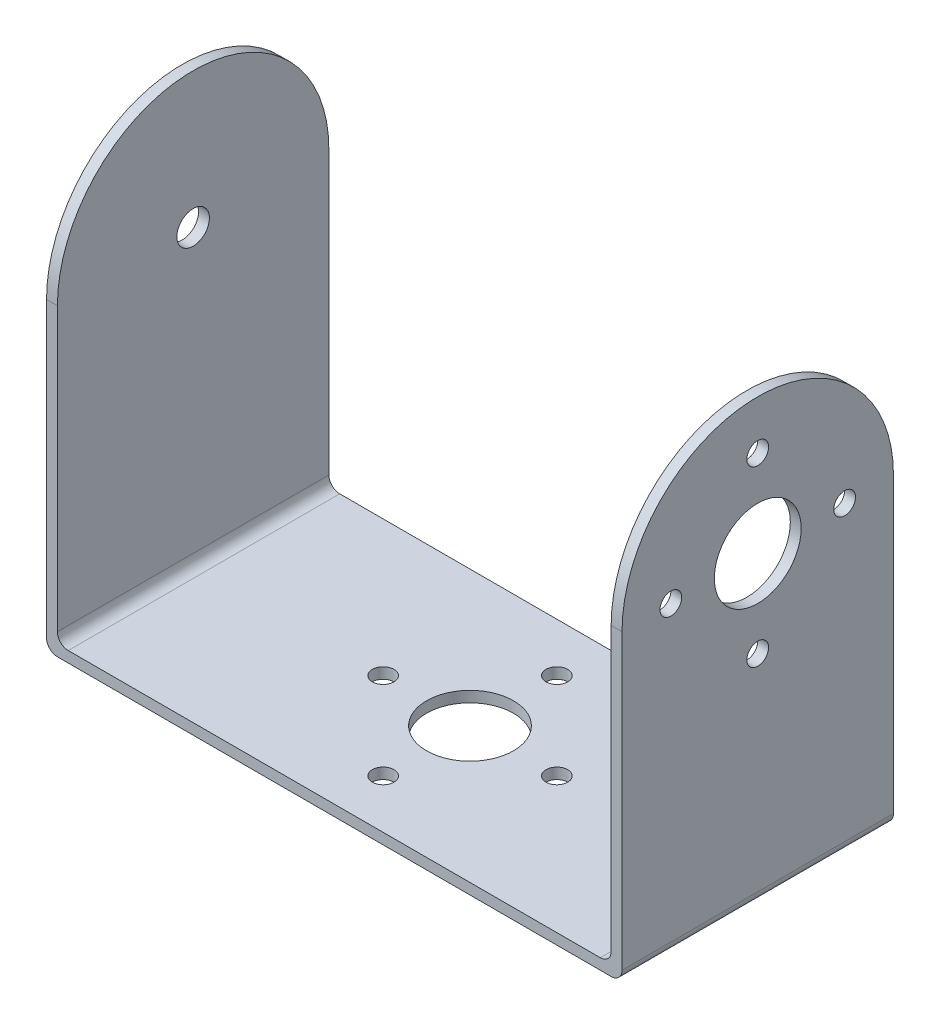
ISO-10303-21;
HEADER;
FILE_DESCRIPTION(('STEP AP214'),'2;1');
FILE_NAME('part.step','',(''),(''),'','','');
FILE_SCHEMA(('AUTOMOTIVE_DESIGN { 1 0 10303 214 1 1 1 1 }'));
ENDSEC;
DATA;
#1=APPLICATION_CONTEXT('core data for automotive mechanical design processes');
#2=APPLICATION_PROTOCOL_DEFINITION('international standard','automotive_design',2000,#1);
#3=PRODUCT_CONTEXT('',#1,'mechanical');
#4=PRODUCT('Part','Part','',(#3));
#5=PRODUCT_RELATED_PRODUCT_CATEGORY('part','',(#4));
#6=PRODUCT_DEFINITION_FORMATION('','',#4);
#7=PRODUCT_DEFINITION_CONTEXT('part definition',#1,'design');
#8=PRODUCT_DEFINITION('design','',#6,#7);
#9=PRODUCT_DEFINITION_SHAPE('','',#8);
#10=(LENGTH_UNIT() NAMED_UNIT(*) SI_UNIT(.MILLI.,.METRE.));
#11=(NAMED_UNIT(*) PLANE_ANGLE_UNIT() SI_UNIT($,.RADIAN.));
#12=(NAMED_UNIT(*) SI_UNIT($,.STERADIAN.) SOLID_ANGLE_UNIT());
#13=UNCERTAINTY_MEASURE_WITH_UNIT(LENGTH_MEASURE(1.E-05),#10,'distance_accuracy_value','');
#14=(GEOMETRIC_REPRESENTATION_CONTEXT(3) GLOBAL_UNCERTAINTY_ASSIGNED_CONTEXT((#13)) GLOBAL_UNIT_ASSIGNED_CONTEXT((#10,
#11,#12)) REPRESENTATION_CONTEXT('',''));
#15=CARTESIAN_POINT('',(0.,0.,0.));
#16=DIRECTION('',(0.,0.,1.));
#17=DIRECTION('',(1.,0.,0.));
#18=AXIS2_PLACEMENT_3D('',#15,#16,#17);
#19=CARTESIAN_POINT('',(51.5,1.50000000000001,-25.));
#20=DIRECTION('',(-1.,0.,0.));
#21=DIRECTION('',(0.,0.,1.));
#22=AXIS2_PLACEMENT_3D('',#19,#20,#21);
#23=PLANE('',#22);
#24=CARTESIAN_POINT('',(51.5,27.5,-4.50000000000011));
#25=DIRECTION('',(-1.,0.,0.));
#26=DIRECTION('',(0.,0.,1.));
#27=AXIS2_PLACEMENT_3D('',#24,#25,#26);
#28=CIRCLE('',#27,1.);
#29=CARTESIAN_POINT('',(51.5,27.5,-3.50000000000011));
#30=VERTEX_POINT('',#29);
#31=EDGE_CURVE('E313',#30,#30,#28,.T.);
#32=ORIENTED_EDGE('',*,*,#31,.F.);
#33=EDGE_LOOP('',(#32));
#34=FACE_BOUND('',#33,.T.);
#35=CARTESIAN_POINT('',(51.5,19.5,-12.5000000000002));
#36=DIRECTION('',(-1.,0.,0.));
#37=DIRECTION('',(0.,0.,1.));
#38=AXIS2_PLACEMENT_3D('',#35,#36,#37);
#39=CIRCLE('',#38,1.);
#40=CARTESIAN_POINT('',(51.5,19.5,-11.5000000000002));
#41=VERTEX_POINT('',#40);
#42=EDGE_CURVE('E307',#41,#41,#39,.T.);
#43=ORIENTED_EDGE('',*,*,#42,.F.);
#44=EDGE_LOOP('',(#43));
#45=FACE_BOUND('',#44,.T.);
#46=CARTESIAN_POINT('',(51.5,27.5000000000001,-20.5000000000001));
#47=DIRECTION('',(-1.,0.,0.));
#48=DIRECTION('',(0.,0.,1.));
#49=AXIS2_PLACEMENT_3D('',#46,#47,#48);
#50=CIRCLE('',#49,1.);
#51=CARTESIAN_POINT('',(51.5,27.5000000000001,-19.5000000000001));
#52=VERTEX_POINT('',#51);
#53=EDGE_CURVE('E301',#52,#52,#50,.T.);
#54=ORIENTED_EDGE('',*,*,#53,.F.);
#55=EDGE_LOOP('',(#54));
#56=FACE_BOUND('',#55,.T.);
#57=CARTESIAN_POINT('',(51.5,35.5,-12.5));
#58=DIRECTION('',(-1.,0.,0.));
#59=DIRECTION('',(0.,0.,1.));
#60=AXIS2_PLACEMENT_3D('',#57,#58,#59);
#61=CIRCLE('',#60,1.);
#62=CARTESIAN_POINT('',(51.5,35.5,-11.5));
#63=VERTEX_POINT('',#62);
#64=EDGE_CURVE('E295',#63,#63,#61,.T.);
#65=ORIENTED_EDGE('',*,*,#64,.F.);
#66=EDGE_LOOP('',(#65));
#67=FACE_BOUND('',#66,.T.);
#68=CARTESIAN_POINT('',(51.5,27.5,-12.5));
#69=DIRECTION('',(-1.,0.,0.));
#70=DIRECTION('',(0.,0.,1.));
#71=AXIS2_PLACEMENT_3D('',#68,#69,#70);
#72=CIRCLE('',#71,4.);
#73=CARTESIAN_POINT('',(51.5,27.5,-8.5));
#74=VERTEX_POINT('',#73);
#75=EDGE_CURVE('E287',#74,#74,#72,.T.);
#76=ORIENTED_EDGE('',*,*,#75,.F.);
#77=EDGE_LOOP('',(#76));
#78=FACE_BOUND('',#77,.T.);
#79=CARTESIAN_POINT('',(51.5,27.5,-12.5));
#80=DIRECTION('',(-1.,0.,0.));
#81=DIRECTION('',(0.,0.,1.));
#82=AXIS2_PLACEMENT_3D('',#79,#80,#81);
#83=CIRCLE('',#82,12.5);
#84=CARTESIAN_POINT('',(51.5,27.5,0.));
#85=VERTEX_POINT('',#84);
#86=CARTESIAN_POINT('',(51.5,27.5,-25.));
#87=VERTEX_POINT('',#86);
#88=EDGE_CURVE('E56',#85,#87,#83,.T.);
#89=ORIENTED_EDGE('',*,*,#88,.T.);
#90=DIRECTION('',(0.,-1.,0.));
#91=VECTOR('',#90,1.);
#92=CARTESIAN_POINT('',(51.5,1.50000000000001,-25.));
#93=LINE('',#92,#91);
#94=CARTESIAN_POINT('',(51.5,1.50000000000001,-25.));
#95=VERTEX_POINT('',#94);
#96=EDGE_CURVE('E145',#87,#95,#93,.T.);
#97=ORIENTED_EDGE('',*,*,#96,.T.);
#98=DIRECTION('',(0.,0.,1.));
#99=VECTOR('',#98,1.);
#100=CARTESIAN_POINT('',(51.5,1.50000000000001,-25.));
#101=LINE('',#100,#99);
#102=CARTESIAN_POINT('',(51.5,1.50000000000001,0.));
#103=VERTEX_POINT('',#102);
#104=EDGE_CURVE('E184',#95,#103,#101,.T.);
#105=ORIENTED_EDGE('',*,*,#104,.T.);
#106=DIRECTION('',(0.,-1.,0.));
#107=VECTOR('',#106,1.);
#108=CARTESIAN_POINT('',(51.5,1.50000000000001,0.));
#109=LINE('',#108,#107);
#110=EDGE_CURVE('E181',#85,#103,#109,.T.);
#111=ORIENTED_EDGE('',*,*,#110,.F.);
#112=EDGE_LOOP('',(#89,#97,#105,#111));
#113=FACE_BOUND('',#112,.T.);
#114=ADVANCED_FACE('F40',(#34,#45,#56,#67,#78,#113),#23,.T.);
#115=CARTESIAN_POINT('',(52.5,0.500000000000007,-25.));
#116=DIRECTION('',(1.,0.,0.));
#117=DIRECTION('',(0.,0.,-1.));
#118=AXIS2_PLACEMENT_3D('',#115,#116,#117);
#119=PLANE('',#118);
#120=CARTESIAN_POINT('',(52.5,27.5,-4.50000000000011));
#121=DIRECTION('',(1.,0.,0.));
#122=DIRECTION('',(0.,0.,-1.));
#123=AXIS2_PLACEMENT_3D('',#120,#121,#122);
#124=CIRCLE('',#123,1.);
#125=CARTESIAN_POINT('',(52.5,27.5,-5.50000000000011));
#126=VERTEX_POINT('',#125);
#127=EDGE_CURVE('E316',#126,#126,#124,.T.);
#128=ORIENTED_EDGE('',*,*,#127,.F.);
#129=EDGE_LOOP('',(#128));
#130=FACE_BOUND('',#129,.T.);
#131=CARTESIAN_POINT('',(52.5,19.5,-12.5000000000002));
#132=DIRECTION('',(1.,0.,0.));
#133=DIRECTION('',(0.,0.,-1.));
#134=AXIS2_PLACEMENT_3D('',#131,#132,#133);
#135=CIRCLE('',#134,1.);
#136=CARTESIAN_POINT('',(52.5,19.5,-13.5000000000002));
#137=VERTEX_POINT('',#136);
#138=EDGE_CURVE('E310',#137,#137,#135,.T.);
#139=ORIENTED_EDGE('',*,*,#138,.F.);
#140=EDGE_LOOP('',(#139));
#141=FACE_BOUND('',#140,.T.);
#142=CARTESIAN_POINT('',(52.5,27.5000000000001,-20.5000000000001));
#143=DIRECTION('',(1.,0.,0.));
#144=DIRECTION('',(0.,0.,-1.));
#145=AXIS2_PLACEMENT_3D('',#142,#143,#144);
#146=CIRCLE('',#145,1.);
#147=CARTESIAN_POINT('',(52.5,27.5000000000001,-21.5000000000001));
#148=VERTEX_POINT('',#147);
#149=EDGE_CURVE('E304',#148,#148,#146,.T.);
#150=ORIENTED_EDGE('',*,*,#149,.F.);
#151=EDGE_LOOP('',(#150));
#152=FACE_BOUND('',#151,.T.);
#153=CARTESIAN_POINT('',(52.5,35.5,-12.5));
#154=DIRECTION('',(1.,0.,0.));
#155=DIRECTION('',(0.,0.,-1.));
#156=AXIS2_PLACEMENT_3D('',#153,#154,#155);
#157=CIRCLE('',#156,1.);
#158=CARTESIAN_POINT('',(52.5,35.5,-13.5));
#159=VERTEX_POINT('',#158);
#160=EDGE_CURVE('E298',#159,#159,#157,.T.);
#161=ORIENTED_EDGE('',*,*,#160,.F.);
#162=EDGE_LOOP('',(#161));
#163=FACE_BOUND('',#162,.T.);
#164=CARTESIAN_POINT('',(52.5,27.5,-12.5));
#165=DIRECTION('',(1.,0.,0.));
#166=DIRECTION('',(0.,0.,-1.));
#167=AXIS2_PLACEMENT_3D('',#164,#165,#166);
#168=CIRCLE('',#167,4.);
#169=CARTESIAN_POINT('',(52.5,27.5,-16.5));
#170=VERTEX_POINT('',#169);
#171=EDGE_CURVE('E292',#170,#170,#168,.T.);
#172=ORIENTED_EDGE('',*,*,#171,.F.);
#173=EDGE_LOOP('',(#172));
#174=FACE_BOUND('',#173,.T.);
#175=DIRECTION('',(0.,1.,0.));
#176=VECTOR('',#175,1.);
#177=CARTESIAN_POINT('',(52.5,0.500000000000007,-25.));
#178=LINE('',#177,#176);
#179=CARTESIAN_POINT('',(52.5,0.500000000000007,-25.));
#180=VERTEX_POINT('',#179);
#181=CARTESIAN_POINT('',(52.5,27.5,-25.));
#182=VERTEX_POINT('',#181);
#183=EDGE_CURVE('E142',#180,#182,#178,.T.);
#184=ORIENTED_EDGE('',*,*,#183,.T.);
#185=CARTESIAN_POINT('',(52.5,27.5,-12.5));
#186=DIRECTION('',(1.,0.,0.));
#187=DIRECTION('',(0.,0.,-1.));
#188=AXIS2_PLACEMENT_3D('',#185,#186,#187);
#189=CIRCLE('',#188,12.5);
#190=CARTESIAN_POINT('',(52.5,27.5,0.));
#191=VERTEX_POINT('',#190);
#192=EDGE_CURVE('E128',#182,#191,#189,.T.);
#193=ORIENTED_EDGE('',*,*,#192,.T.);
#194=DIRECTION('',(0.,1.,0.));
#195=VECTOR('',#194,1.);
#196=CARTESIAN_POINT('',(52.5,0.500000000000007,0.));
#197=LINE('',#196,#195);
#198=CARTESIAN_POINT('',(52.5,0.500000000000007,0.));
#199=VERTEX_POINT('',#198);
#200=EDGE_CURVE('E179',#199,#191,#197,.T.);
#201=ORIENTED_EDGE('',*,*,#200,.F.);
#202=DIRECTION('',(0.,0.,1.));
#203=VECTOR('',#202,1.);
#204=CARTESIAN_POINT('',(52.5,0.500000000000007,-25.));
#205=LINE('',#204,#203);
#206=EDGE_CURVE('E147',#180,#199,#205,.T.);
#207=ORIENTED_EDGE('',*,*,#206,.F.);
#208=EDGE_LOOP('',(#184,#193,#201,#207));
#209=FACE_BOUND('',#208,.T.);
#210=ADVANCED_FACE('F146',(#130,#141,#152,#163,#174,#209),#119,.T.);
#211=CARTESIAN_POINT('',(-0.5,0.500000000000007,-25.));
#212=DIRECTION('',(-1.,0.,0.));
#213=DIRECTION('',(0.,0.,1.));
#214=AXIS2_PLACEMENT_3D('',#211,#212,#213);
#215=PLANE('',#214);
#216=CARTESIAN_POINT('',(-0.5,27.5,-12.5));
#217=DIRECTION('',(-1.,0.,0.));
#218=DIRECTION('',(0.,0.,1.));
#219=AXIS2_PLACEMENT_3D('',#216,#217,#218);
#220=CIRCLE('',#219,1.5);
#221=CARTESIAN_POINT('',(-0.5,27.5,-11.));
#222=VERTEX_POINT('',#221);
#223=EDGE_CURVE('E319',#222,#222,#220,.T.);
#224=ORIENTED_EDGE('',*,*,#223,.F.);
#225=EDGE_LOOP('',(#224));
#226=FACE_BOUND('',#225,.T.);
#227=CARTESIAN_POINT('',(-0.5,27.5,-12.5));
#228=DIRECTION('',(1.,0.,0.));
#229=DIRECTION('',(0.,0.,-1.));
#230=AXIS2_PLACEMENT_3D('',#227,#228,#229);
#231=CIRCLE('',#230,12.5);
#232=CARTESIAN_POINT('',(-0.5,27.5,-25.));
#233=VERTEX_POINT('',#232);
#234=CARTESIAN_POINT('',(-0.5,27.5,0.));
#235=VERTEX_POINT('',#234);
#236=EDGE_CURVE('E64',#233,#235,#231,.T.);
#237=ORIENTED_EDGE('',*,*,#236,.F.);
#238=DIRECTION('',(0.,-1.,0.));
#239=VECTOR('',#238,1.);
#240=CARTESIAN_POINT('',(-0.5,0.500000000000007,-25.));
#241=LINE('',#240,#239);
#242=CARTESIAN_POINT('',(-0.5,0.500000000000007,-25.));
#243=VERTEX_POINT('',#242);
#244=EDGE_CURVE('E227',#233,#243,#241,.T.);
#245=ORIENTED_EDGE('',*,*,#244,.T.);
#246=DIRECTION('',(0.,0.,1.));
#247=VECTOR('',#246,1.);
#248=CARTESIAN_POINT('',(-0.5,0.500000000000007,-25.));
#249=LINE('',#248,#247);
#250=CARTESIAN_POINT('',(-0.5,0.500000000000007,0.));
#251=VERTEX_POINT('',#250);
#252=EDGE_CURVE('E192',#243,#251,#249,.T.);
#253=ORIENTED_EDGE('',*,*,#252,.T.);
#254=DIRECTION('',(0.,-1.,0.));
#255=VECTOR('',#254,1.);
#256=CARTESIAN_POINT('',(-0.5,0.500000000000007,0.));
#257=LINE('',#256,#255);
#258=EDGE_CURVE('E168',#235,#251,#257,.T.);
#259=ORIENTED_EDGE('',*,*,#258,.F.);
#260=EDGE_LOOP('',(#237,#245,#253,#259));
#261=FACE_BOUND('',#260,.T.);
#262=ADVANCED_FACE('F244',(#226,#261),#215,.T.);
#263=CARTESIAN_POINT('',(0.5,1.50000000000001,-25.));
#264=DIRECTION('',(1.,0.,0.));
#265=DIRECTION('',(0.,0.,-1.));
#266=AXIS2_PLACEMENT_3D('',#263,#264,#265);
#267=PLANE('',#266);
#268=CARTESIAN_POINT('',(0.5,27.5,-12.5));
#269=DIRECTION('',(1.,0.,0.));
#270=DIRECTION('',(0.,0.,-1.));
#271=AXIS2_PLACEMENT_3D('',#268,#269,#270);
#272=CIRCLE('',#271,1.5);
#273=CARTESIAN_POINT('',(0.5,27.5,-14.));
#274=VERTEX_POINT('',#273);
#275=EDGE_CURVE('E44',#274,#274,#272,.T.);
#276=ORIENTED_EDGE('',*,*,#275,.F.);
#277=EDGE_LOOP('',(#276));
#278=FACE_BOUND('',#277,.T.);
#279=DIRECTION('',(0.,1.,0.));
#280=VECTOR('',#279,1.);
#281=CARTESIAN_POINT('',(0.5,1.50000000000001,-25.));
#282=LINE('',#281,#280);
#283=CARTESIAN_POINT('',(0.5,1.50000000000001,-25.));
#284=VERTEX_POINT('',#283);
#285=CARTESIAN_POINT('',(0.5,27.5,-25.));
#286=VERTEX_POINT('',#285);
#287=EDGE_CURVE('E224',#284,#286,#282,.T.);
#288=ORIENTED_EDGE('',*,*,#287,.T.);
#289=CARTESIAN_POINT('',(0.5,27.5,-12.5));
#290=DIRECTION('',(1.,0.,0.));
#291=DIRECTION('',(0.,0.,-1.));
#292=AXIS2_PLACEMENT_3D('',#289,#290,#291);
#293=CIRCLE('',#292,12.5);
#294=CARTESIAN_POINT('',(0.5,27.5,0.));
#295=VERTEX_POINT('',#294);
#296=EDGE_CURVE('E253',#286,#295,#293,.T.);
#297=ORIENTED_EDGE('',*,*,#296,.T.);
#298=DIRECTION('',(0.,1.,0.));
#299=VECTOR('',#298,1.);
#300=CARTESIAN_POINT('',(0.5,1.50000000000001,0.));
#301=LINE('',#300,#299);
#302=CARTESIAN_POINT('',(0.5,1.50000000000001,0.));
#303=VERTEX_POINT('',#302);
#304=EDGE_CURVE('E165',#303,#295,#301,.T.);
#305=ORIENTED_EDGE('',*,*,#304,.F.);
#306=DIRECTION('',(0.,0.,1.));
#307=VECTOR('',#306,1.);
#308=CARTESIAN_POINT('',(0.5,1.50000000000001,-25.));
#309=LINE('',#308,#307);
#310=EDGE_CURVE('E195',#284,#303,#309,.T.);
#311=ORIENTED_EDGE('',*,*,#310,.F.);
#312=EDGE_LOOP('',(#288,#297,#305,#311));
#313=FACE_BOUND('',#312,.T.);
#314=ADVANCED_FACE('F251',(#278,#313),#267,.T.);
#315=CARTESIAN_POINT('',(50.5,1.5,-25.));
#316=DIRECTION('',(0.,0.,1.));
#317=DIRECTION('',(1.,0.,0.));
#318=AXIS2_PLACEMENT_3D('',#315,#316,#317);
#319=CYLINDRICAL_SURFACE('',#318,1.);
#320=CARTESIAN_POINT('',(50.5,1.5,0.));
#321=DIRECTION('',(0.,0.,-1.));
#322=DIRECTION('',(1.,0.,0.));
#323=AXIS2_PLACEMENT_3D('',#320,#321,#322);
#324=CIRCLE('',#323,1.);
#325=CARTESIAN_POINT('',(50.5,0.5,0.));
#326=VERTEX_POINT('',#325);
#327=EDGE_CURVE('E156',#103,#326,#324,.T.);
#328=ORIENTED_EDGE('',*,*,#327,.F.);
#329=ORIENTED_EDGE('',*,*,#104,.F.);
#330=CARTESIAN_POINT('',(50.5,1.5,-25.));
#331=DIRECTION('',(0.,0.,-1.));
#332=DIRECTION('',(1.,0.,0.));
#333=AXIS2_PLACEMENT_3D('',#330,#331,#332);
#334=CIRCLE('',#333,1.);
#335=CARTESIAN_POINT('',(50.5,0.5,-25.));
#336=VERTEX_POINT('',#335);
#337=EDGE_CURVE('E183',#95,#336,#334,.T.);
#338=ORIENTED_EDGE('',*,*,#337,.T.);
#339=DIRECTION('',(0.,0.,1.));
#340=VECTOR('',#339,1.);
#341=CARTESIAN_POINT('',(50.5,0.5,-25.));
#342=LINE('',#341,#340);
#343=EDGE_CURVE('E150',#336,#326,#342,.T.);
#344=ORIENTED_EDGE('',*,*,#343,.T.);
#345=EDGE_LOOP('',(#328,#329,#338,#344));
#346=FACE_BOUND('',#345,.T.);
#347=ADVANCED_FACE('F42',(#346),#319,.F.);
#348=CARTESIAN_POINT('',(51.5,0.5,-25.));
#349=DIRECTION('',(0.,0.,1.));
#350=DIRECTION('',(1.,0.,0.));
#351=AXIS2_PLACEMENT_3D('',#348,#349,#350);
#352=CYLINDRICAL_SURFACE('',#351,1.);
#353=CARTESIAN_POINT('',(51.5,0.5,0.));
#354=DIRECTION('',(0.,0.,1.));
#355=DIRECTION('',(1.,0.,0.));
#356=AXIS2_PLACEMENT_3D('',#353,#354,#355);
#357=CIRCLE('',#356,1.);
#358=CARTESIAN_POINT('',(51.5,-0.5,0.));
#359=VERTEX_POINT('',#358);
#360=EDGE_CURVE('E176',#359,#199,#357,.T.);
#361=ORIENTED_EDGE('',*,*,#360,.F.);
#362=DIRECTION('',(0.,0.,1.));
#363=VECTOR('',#362,1.);
#364=CARTESIAN_POINT('',(51.5,-0.5,-25.));
#365=LINE('',#364,#363);
#366=CARTESIAN_POINT('',(51.5,-0.5,-25.));
#367=VERTEX_POINT('',#366);
#368=EDGE_CURVE('E188',#367,#359,#365,.T.);
#369=ORIENTED_EDGE('',*,*,#368,.F.);
#370=CARTESIAN_POINT('',(51.5,0.5,-25.));
#371=DIRECTION('',(0.,0.,1.));
#372=DIRECTION('',(1.,0.,0.));
#373=AXIS2_PLACEMENT_3D('',#370,#371,#372);
#374=CIRCLE('',#373,1.);
#375=EDGE_CURVE('E148',#367,#180,#374,.T.);
#376=ORIENTED_EDGE('',*,*,#375,.T.);
#377=ORIENTED_EDGE('',*,*,#206,.T.);
#378=EDGE_LOOP('',(#361,#369,#376,#377));
#379=FACE_BOUND('',#378,.T.);
#380=ADVANCED_FACE('F334',(#379),#352,.T.);
#381=CARTESIAN_POINT('',(0.500000000000007,-0.5,-25.));
#382=DIRECTION('',(0.,-1.,0.));
#383=DIRECTION('',(0.,0.,-1.));
#384=AXIS2_PLACEMENT_3D('',#381,#382,#383);
#385=PLANE('',#384);
#386=CARTESIAN_POINT('',(26.0000000000002,-0.5,-4.5));
#387=DIRECTION('',(0.,1.,0.));
#388=DIRECTION('',(0.,0.,1.));
#389=AXIS2_PLACEMENT_3D('',#386,#387,#388);
#390=CIRCLE('',#389,1.);
#391=CARTESIAN_POINT('',(26.0000000000002,-0.5,-3.5));
#392=VERTEX_POINT('',#391);
#393=EDGE_CURVE('E284',#392,#392,#390,.T.);
#394=ORIENTED_EDGE('',*,*,#393,.T.);
#395=EDGE_LOOP('',(#394));
#396=FACE_BOUND('',#395,.T.);
#397=CARTESIAN_POINT('',(18.0000000000001,-0.5,-12.5));
#398=DIRECTION('',(0.,1.,0.));
#399=DIRECTION('',(0.,0.,1.));
#400=AXIS2_PLACEMENT_3D('',#397,#398,#399);
#401=CIRCLE('',#400,1.);
#402=CARTESIAN_POINT('',(18.0000000000001,-0.5,-11.5));
#403=VERTEX_POINT('',#402);
#404=EDGE_CURVE('E278',#403,#403,#401,.T.);
#405=ORIENTED_EDGE('',*,*,#404,.T.);
#406=EDGE_LOOP('',(#405));
#407=FACE_BOUND('',#406,.T.);
#408=CARTESIAN_POINT('',(26.,-0.5,-20.5));
#409=DIRECTION('',(0.,1.,0.));
#410=DIRECTION('',(0.,0.,1.));
#411=AXIS2_PLACEMENT_3D('',#408,#409,#410);
#412=CIRCLE('',#411,1.);
#413=CARTESIAN_POINT('',(26.,-0.5,-19.5));
#414=VERTEX_POINT('',#413);
#415=EDGE_CURVE('E272',#414,#414,#412,.T.);
#416=ORIENTED_EDGE('',*,*,#415,.T.);
#417=EDGE_LOOP('',(#416));
#418=FACE_BOUND('',#417,.T.);
#419=CARTESIAN_POINT('',(34.0000000000001,-0.5,-12.5000000000001));
#420=DIRECTION('',(0.,1.,0.));
#421=DIRECTION('',(0.,0.,1.));
#422=AXIS2_PLACEMENT_3D('',#419,#420,#421);
#423=CIRCLE('',#422,1.);
#424=CARTESIAN_POINT('',(34.0000000000001,-0.5,-11.5000000000001));
#425=VERTEX_POINT('',#424);
#426=EDGE_CURVE('E266',#425,#425,#423,.T.);
#427=ORIENTED_EDGE('',*,*,#426,.T.);
#428=EDGE_LOOP('',(#427));
#429=FACE_BOUND('',#428,.T.);
#430=CARTESIAN_POINT('',(26.,-0.5,-12.5));
#431=DIRECTION('',(0.,1.,0.));
#432=DIRECTION('',(0.,0.,1.));
#433=AXIS2_PLACEMENT_3D('',#430,#431,#432);
#434=CIRCLE('',#433,4.);
#435=CARTESIAN_POINT('',(26.,-0.5,-8.5));
#436=VERTEX_POINT('',#435);
#437=EDGE_CURVE('E247',#436,#436,#434,.T.);
#438=ORIENTED_EDGE('',*,*,#437,.T.);
#439=EDGE_LOOP('',(#438));
#440=FACE_BOUND('',#439,.T.);
#441=DIRECTION('',(1.,0.,0.));
#442=VECTOR('',#441,1.);
#443=CARTESIAN_POINT('',(0.500000000000007,-0.5,0.));
#444=LINE('',#443,#442);
#445=CARTESIAN_POINT('',(0.500000000000007,-0.5,0.));
#446=VERTEX_POINT('',#445);
#447=EDGE_CURVE('E173',#446,#359,#444,.T.);
#448=ORIENTED_EDGE('',*,*,#447,.F.);
#449=DIRECTION('',(0.,0.,1.));
#450=VECTOR('',#449,1.);
#451=CARTESIAN_POINT('',(0.500000000000007,-0.5,-25.));
#452=LINE('',#451,#450);
#453=CARTESIAN_POINT('',(0.500000000000007,-0.5,-25.));
#454=VERTEX_POINT('',#453);
#455=EDGE_CURVE('E190',#454,#446,#452,.T.);
#456=ORIENTED_EDGE('',*,*,#455,.F.);
#457=DIRECTION('',(1.,0.,0.));
#458=VECTOR('',#457,1.);
#459=CARTESIAN_POINT('',(0.500000000000007,-0.5,-25.));
#460=LINE('',#459,#458);
#461=EDGE_CURVE('E152',#454,#367,#460,.T.);
#462=ORIENTED_EDGE('',*,*,#461,.T.);
#463=ORIENTED_EDGE('',*,*,#368,.T.);
#464=EDGE_LOOP('',(#448,#456,#462,#463));
#465=FACE_BOUND('',#464,.T.);
#466=ADVANCED_FACE('F235',(#396,#407,#418,#429,#440,#465),#385,.T.);
#467=CARTESIAN_POINT('',(0.5,0.5,-25.));
#468=DIRECTION('',(0.,0.,1.));
#469=DIRECTION('',(1.,0.,0.));
#470=AXIS2_PLACEMENT_3D('',#467,#468,#469);
#471=CYLINDRICAL_SURFACE('',#470,1.);
#472=CARTESIAN_POINT('',(0.5,0.5,0.));
#473=DIRECTION('',(0.,0.,1.));
#474=DIRECTION('',(1.,0.,0.));
#475=AXIS2_PLACEMENT_3D('',#472,#473,#474);
#476=CIRCLE('',#475,1.);
#477=EDGE_CURVE('E170',#251,#446,#476,.T.);
#478=ORIENTED_EDGE('',*,*,#477,.F.);
#479=ORIENTED_EDGE('',*,*,#252,.F.);
#480=CARTESIAN_POINT('',(0.5,0.5,-25.));
#481=DIRECTION('',(0.,0.,1.));
#482=DIRECTION('',(1.,0.,0.));
#483=AXIS2_PLACEMENT_3D('',#480,#481,#482);
#484=CIRCLE('',#483,1.);
#485=EDGE_CURVE('E229',#243,#454,#484,.T.);
#486=ORIENTED_EDGE('',*,*,#485,.T.);
#487=ORIENTED_EDGE('',*,*,#455,.T.);
#488=EDGE_LOOP('',(#478,#479,#486,#487));
#489=FACE_BOUND('',#488,.T.);
#490=ADVANCED_FACE('F241',(#489),#471,.T.);
#491=CARTESIAN_POINT('',(1.5,1.5,-25.));
#492=DIRECTION('',(0.,0.,1.));
#493=DIRECTION('',(1.,0.,0.));
#494=AXIS2_PLACEMENT_3D('',#491,#492,#493);
#495=CYLINDRICAL_SURFACE('',#494,1.);
#496=CARTESIAN_POINT('',(1.5,1.5,0.));
#497=DIRECTION('',(0.,0.,-1.));
#498=DIRECTION('',(1.,0.,0.));
#499=AXIS2_PLACEMENT_3D('',#496,#497,#498);
#500=CIRCLE('',#499,1.);
#501=CARTESIAN_POINT('',(1.50000000000001,0.5,0.));
#502=VERTEX_POINT('',#501);
#503=EDGE_CURVE('E162',#502,#303,#500,.T.);
#504=ORIENTED_EDGE('',*,*,#503,.F.);
#505=DIRECTION('',(0.,0.,1.));
#506=VECTOR('',#505,1.);
#507=CARTESIAN_POINT('',(1.50000000000001,0.5,-25.));
#508=LINE('',#507,#506);
#509=CARTESIAN_POINT('',(1.50000000000001,0.5,-25.));
#510=VERTEX_POINT('',#509);
#511=EDGE_CURVE('E197',#510,#502,#508,.T.);
#512=ORIENTED_EDGE('',*,*,#511,.F.);
#513=CARTESIAN_POINT('',(1.5,1.5,-25.));
#514=DIRECTION('',(0.,0.,-1.));
#515=DIRECTION('',(1.,0.,0.));
#516=AXIS2_PLACEMENT_3D('',#513,#514,#515);
#517=CIRCLE('',#516,1.);
#518=EDGE_CURVE('E217',#510,#284,#517,.T.);
#519=ORIENTED_EDGE('',*,*,#518,.T.);
#520=ORIENTED_EDGE('',*,*,#310,.T.);
#521=EDGE_LOOP('',(#504,#512,#519,#520));
#522=FACE_BOUND('',#521,.T.);
#523=ADVANCED_FACE('F255',(#522),#495,.F.);
#524=CARTESIAN_POINT('',(1.50000000000001,0.5,-25.));
#525=DIRECTION('',(0.,1.,0.));
#526=DIRECTION('',(0.,0.,1.));
#527=AXIS2_PLACEMENT_3D('',#524,#525,#526);
#528=PLANE('',#527);
#529=CARTESIAN_POINT('',(26.0000000000002,0.5,-4.5));
#530=DIRECTION('',(0.,1.,0.));
#531=DIRECTION('',(0.,0.,1.));
#532=AXIS2_PLACEMENT_3D('',#529,#530,#531);
#533=CIRCLE('',#532,1.);
#534=CARTESIAN_POINT('',(26.0000000000002,0.5,-3.5));
#535=VERTEX_POINT('',#534);
#536=EDGE_CURVE('E281',#535,#535,#533,.T.);
#537=ORIENTED_EDGE('',*,*,#536,.F.);
#538=EDGE_LOOP('',(#537));
#539=FACE_BOUND('',#538,.T.);
#540=CARTESIAN_POINT('',(18.0000000000001,0.5,-12.5));
#541=DIRECTION('',(0.,1.,0.));
#542=DIRECTION('',(0.,0.,1.));
#543=AXIS2_PLACEMENT_3D('',#540,#541,#542);
#544=CIRCLE('',#543,1.);
#545=CARTESIAN_POINT('',(18.0000000000001,0.5,-11.5));
#546=VERTEX_POINT('',#545);
#547=EDGE_CURVE('E275',#546,#546,#544,.T.);
#548=ORIENTED_EDGE('',*,*,#547,.F.);
#549=EDGE_LOOP('',(#548));
#550=FACE_BOUND('',#549,.T.);
#551=CARTESIAN_POINT('',(26.,0.5,-20.5));
#552=DIRECTION('',(0.,1.,0.));
#553=DIRECTION('',(0.,0.,1.));
#554=AXIS2_PLACEMENT_3D('',#551,#552,#553);
#555=CIRCLE('',#554,1.);
#556=CARTESIAN_POINT('',(26.,0.5,-19.5));
#557=VERTEX_POINT('',#556);
#558=EDGE_CURVE('E269',#557,#557,#555,.T.);
#559=ORIENTED_EDGE('',*,*,#558,.F.);
#560=EDGE_LOOP('',(#559));
#561=FACE_BOUND('',#560,.T.);
#562=CARTESIAN_POINT('',(34.0000000000001,0.5,-12.5000000000001));
#563=DIRECTION('',(0.,1.,0.));
#564=DIRECTION('',(0.,0.,1.));
#565=AXIS2_PLACEMENT_3D('',#562,#563,#564);
#566=CIRCLE('',#565,1.);
#567=CARTESIAN_POINT('',(34.0000000000001,0.5,-11.5000000000001));
#568=VERTEX_POINT('',#567);
#569=EDGE_CURVE('E263',#568,#568,#566,.T.);
#570=ORIENTED_EDGE('',*,*,#569,.F.);
#571=EDGE_LOOP('',(#570));
#572=FACE_BOUND('',#571,.T.);
#573=CARTESIAN_POINT('',(26.,0.5,-12.5));
#574=DIRECTION('',(0.,1.,0.));
#575=DIRECTION('',(0.,0.,1.));
#576=AXIS2_PLACEMENT_3D('',#573,#574,#575);
#577=CIRCLE('',#576,4.);
#578=CARTESIAN_POINT('',(26.,0.5,-8.5));
#579=VERTEX_POINT('',#578);
#580=EDGE_CURVE('E260',#579,#579,#577,.T.);
#581=ORIENTED_EDGE('',*,*,#580,.F.);
#582=EDGE_LOOP('',(#581));
#583=FACE_BOUND('',#582,.T.);
#584=DIRECTION('',(-1.,0.,0.));
#585=VECTOR('',#584,1.);
#586=CARTESIAN_POINT('',(1.50000000000001,0.5,0.));
#587=LINE('',#586,#585);
#588=EDGE_CURVE('E159',#326,#502,#587,.T.);
#589=ORIENTED_EDGE('',*,*,#588,.F.);
#590=ORIENTED_EDGE('',*,*,#343,.F.);
#591=DIRECTION('',(-1.,0.,0.));
#592=VECTOR('',#591,1.);
#593=CARTESIAN_POINT('',(1.50000000000001,0.5,-25.));
#594=LINE('',#593,#592);
#595=EDGE_CURVE('E215',#336,#510,#594,.T.);
#596=ORIENTED_EDGE('',*,*,#595,.T.);
#597=ORIENTED_EDGE('',*,*,#511,.T.);
#598=EDGE_LOOP('',(#589,#590,#596,#597));
#599=FACE_BOUND('',#598,.T.);
#600=ADVANCED_FACE('F208',(#539,#550,#561,#572,#583,#599),#528,.T.);
#601=CARTESIAN_POINT('',(50.5,1.5,-25.));
#602=DIRECTION('',(0.,0.,1.));
#603=DIRECTION('',(1.,0.,0.));
#604=AXIS2_PLACEMENT_3D('',#601,#602,#603);
#605=PLANE('',#604);
#606=ORIENTED_EDGE('',*,*,#244,.F.);
#607=DIRECTION('',(1.,0.,0.));
#608=VECTOR('',#607,1.);
#609=CARTESIAN_POINT('',(-0.5,27.5,-25.));
#610=LINE('',#609,#608);
#611=EDGE_CURVE('E135',#233,#286,#610,.T.);
#612=ORIENTED_EDGE('',*,*,#611,.T.);
#613=ORIENTED_EDGE('',*,*,#287,.F.);
#614=ORIENTED_EDGE('',*,*,#518,.F.);
#615=ORIENTED_EDGE('',*,*,#595,.F.);
#616=ORIENTED_EDGE('',*,*,#337,.F.);
#617=ORIENTED_EDGE('',*,*,#96,.F.);
#618=DIRECTION('',(1.,0.,0.));
#619=VECTOR('',#618,1.);
#620=CARTESIAN_POINT('',(-0.5,27.5,-25.));
#621=LINE('',#620,#619);
#622=EDGE_CURVE('E12',#87,#182,#621,.T.);
#623=ORIENTED_EDGE('',*,*,#622,.T.);
#624=ORIENTED_EDGE('',*,*,#183,.F.);
#625=ORIENTED_EDGE('',*,*,#375,.F.);
#626=ORIENTED_EDGE('',*,*,#461,.F.);
#627=ORIENTED_EDGE('',*,*,#485,.F.);
#628=EDGE_LOOP('',(#606,#612,#613,#614,#615,#616,#617,#623,#624,#625,#626,#627));
#629=FACE_BOUND('',#628,.T.);
#630=ADVANCED_FACE('F140',(#629),#605,.F.);
#631=CARTESIAN_POINT('',(50.5,1.5,0.));
#632=DIRECTION('',(0.,0.,1.));
#633=DIRECTION('',(1.,0.,0.));
#634=AXIS2_PLACEMENT_3D('',#631,#632,#633);
#635=PLANE('',#634);
#636=DIRECTION('',(1.,0.,0.));
#637=VECTOR('',#636,1.);
#638=CARTESIAN_POINT('',(-0.5,27.5,0.));
#639=LINE('',#638,#637);
#640=EDGE_CURVE('E256',#235,#295,#639,.T.);
#641=ORIENTED_EDGE('',*,*,#640,.F.);
#642=ORIENTED_EDGE('',*,*,#258,.T.);
#643=ORIENTED_EDGE('',*,*,#477,.T.);
#644=ORIENTED_EDGE('',*,*,#447,.T.);
#645=ORIENTED_EDGE('',*,*,#360,.T.);
#646=ORIENTED_EDGE('',*,*,#200,.T.);
#647=DIRECTION('',(1.,0.,0.));
#648=VECTOR('',#647,1.);
#649=CARTESIAN_POINT('',(-0.5,27.5,0.));
#650=LINE('',#649,#648);
#651=EDGE_CURVE('E49',#85,#191,#650,.T.);
#652=ORIENTED_EDGE('',*,*,#651,.F.);
#653=ORIENTED_EDGE('',*,*,#110,.T.);
#654=ORIENTED_EDGE('',*,*,#327,.T.);
#655=ORIENTED_EDGE('',*,*,#588,.T.);
#656=ORIENTED_EDGE('',*,*,#503,.T.);
#657=ORIENTED_EDGE('',*,*,#304,.T.);
#658=EDGE_LOOP('',(#641,#642,#643,#644,#645,#646,#652,#653,#654,#655,#656,#657));
#659=FACE_BOUND('',#658,.T.);
#660=ADVANCED_FACE('F211',(#659),#635,.T.);
#661=CARTESIAN_POINT('',(-0.5,27.5,-12.5));
#662=DIRECTION('',(1.,0.,0.));
#663=DIRECTION('',(0.,0.,-1.));
#664=AXIS2_PLACEMENT_3D('',#661,#662,#663);
#665=CYLINDRICAL_SURFACE('',#664,12.5);
#666=ORIENTED_EDGE('',*,*,#651,.T.);
#667=ORIENTED_EDGE('',*,*,#192,.F.);
#668=ORIENTED_EDGE('',*,*,#622,.F.);
#669=ORIENTED_EDGE('',*,*,#88,.F.);
#670=EDGE_LOOP('',(#666,#667,#668,#669));
#671=FACE_BOUND('',#670,.T.);
#672=ADVANCED_FACE('F129',(#671),#665,.T.);
#673=ORIENTED_EDGE('',*,*,#296,.F.);
#674=ORIENTED_EDGE('',*,*,#611,.F.);
#675=ORIENTED_EDGE('',*,*,#236,.T.);
#676=ORIENTED_EDGE('',*,*,#640,.T.);
#677=EDGE_LOOP('',(#673,#674,#675,#676));
#678=FACE_BOUND('',#677,.T.);
#679=ADVANCED_FACE('F381',(#678),#665,.T.);
#680=CARTESIAN_POINT('',(26.,-0.5,-12.5));
#681=DIRECTION('',(0.,1.,0.));
#682=DIRECTION('',(0.,0.,1.));
#683=AXIS2_PLACEMENT_3D('',#680,#681,#682);
#684=CYLINDRICAL_SURFACE('',#683,4.);
#685=ORIENTED_EDGE('',*,*,#437,.F.);
#686=EDGE_LOOP('',(#685));
#687=FACE_BOUND('',#686,.T.);
#688=ORIENTED_EDGE('',*,*,#580,.T.);
#689=EDGE_LOOP('',(#688));
#690=FACE_BOUND('',#689,.T.);
#691=ADVANCED_FACE('F378',(#687,#690),#684,.F.);
#692=CARTESIAN_POINT('',(34.0000000000001,-0.5,-12.5000000000001));
#693=DIRECTION('',(0.,1.,0.));
#694=DIRECTION('',(0.,0.,1.));
#695=AXIS2_PLACEMENT_3D('',#692,#693,#694);
#696=CYLINDRICAL_SURFACE('',#695,1.);
#697=ORIENTED_EDGE('',*,*,#426,.F.);
#698=EDGE_LOOP('',(#697));
#699=FACE_BOUND('',#698,.T.);
#700=ORIENTED_EDGE('',*,*,#569,.T.);
#701=EDGE_LOOP('',(#700));
#702=FACE_BOUND('',#701,.T.);
#703=ADVANCED_FACE('F380',(#699,#702),#696,.F.);
#704=CARTESIAN_POINT('',(26.,-0.5,-20.5));
#705=DIRECTION('',(0.,1.,0.));
#706=DIRECTION('',(0.,0.,1.));
#707=AXIS2_PLACEMENT_3D('',#704,#705,#706);
#708=CYLINDRICAL_SURFACE('',#707,1.);
#709=ORIENTED_EDGE('',*,*,#415,.F.);
#710=EDGE_LOOP('',(#709));
#711=FACE_BOUND('',#710,.T.);
#712=ORIENTED_EDGE('',*,*,#558,.T.);
#713=EDGE_LOOP('',(#712));
#714=FACE_BOUND('',#713,.T.);
#715=ADVANCED_FACE('F388',(#711,#714),#708,.F.);
#716=CARTESIAN_POINT('',(18.0000000000001,-0.5,-12.5));
#717=DIRECTION('',(0.,1.,0.));
#718=DIRECTION('',(0.,0.,1.));
#719=AXIS2_PLACEMENT_3D('',#716,#717,#718);
#720=CYLINDRICAL_SURFACE('',#719,1.);
#721=ORIENTED_EDGE('',*,*,#404,.F.);
#722=EDGE_LOOP('',(#721));
#723=FACE_BOUND('',#722,.T.);
#724=ORIENTED_EDGE('',*,*,#547,.T.);
#725=EDGE_LOOP('',(#724));
#726=FACE_BOUND('',#725,.T.);
#727=ADVANCED_FACE('F396',(#723,#726),#720,.F.);
#728=CARTESIAN_POINT('',(26.0000000000002,-0.5,-4.5));
#729=DIRECTION('',(0.,1.,0.));
#730=DIRECTION('',(0.,0.,1.));
#731=AXIS2_PLACEMENT_3D('',#728,#729,#730);
#732=CYLINDRICAL_SURFACE('',#731,1.);
#733=ORIENTED_EDGE('',*,*,#393,.F.);
#734=EDGE_LOOP('',(#733));
#735=FACE_BOUND('',#734,.T.);
#736=ORIENTED_EDGE('',*,*,#536,.T.);
#737=EDGE_LOOP('',(#736));
#738=FACE_BOUND('',#737,.T.);
#739=ADVANCED_FACE('F400',(#735,#738),#732,.F.);
#740=CARTESIAN_POINT('',(27.5,27.5,-12.5));
#741=DIRECTION('',(1.,0.,0.));
#742=DIRECTION('',(0.,0.,-1.));
#743=AXIS2_PLACEMENT_3D('',#740,#741,#742);
#744=CYLINDRICAL_SURFACE('',#743,4.);
#745=ORIENTED_EDGE('',*,*,#75,.T.);
#746=EDGE_LOOP('',(#745));
#747=FACE_BOUND('',#746,.T.);
#748=ORIENTED_EDGE('',*,*,#171,.T.);
#749=EDGE_LOOP('',(#748));
#750=FACE_BOUND('',#749,.T.);
#751=ADVANCED_FACE('F404',(#747,#750),#744,.F.);
#752=CARTESIAN_POINT('',(27.5,35.5,-12.5));
#753=DIRECTION('',(1.,0.,0.));
#754=DIRECTION('',(0.,0.,-1.));
#755=AXIS2_PLACEMENT_3D('',#752,#753,#754);
#756=CYLINDRICAL_SURFACE('',#755,1.);
#757=ORIENTED_EDGE('',*,*,#64,.T.);
#758=EDGE_LOOP('',(#757));
#759=FACE_BOUND('',#758,.T.);
#760=ORIENTED_EDGE('',*,*,#160,.T.);
#761=EDGE_LOOP('',(#760));
#762=FACE_BOUND('',#761,.T.);
#763=ADVANCED_FACE('F408',(#759,#762),#756,.F.);
#764=CARTESIAN_POINT('',(27.5,27.5000000000001,-20.5000000000001));
#765=DIRECTION('',(1.,0.,0.));
#766=DIRECTION('',(0.,0.,-1.));
#767=AXIS2_PLACEMENT_3D('',#764,#765,#766);
#768=CYLINDRICAL_SURFACE('',#767,1.);
#769=ORIENTED_EDGE('',*,*,#53,.T.);
#770=EDGE_LOOP('',(#769));
#771=FACE_BOUND('',#770,.T.);
#772=ORIENTED_EDGE('',*,*,#149,.T.);
#773=EDGE_LOOP('',(#772));
#774=FACE_BOUND('',#773,.T.);
#775=ADVANCED_FACE('F412',(#771,#774),#768,.F.);
#776=CARTESIAN_POINT('',(27.5,19.5,-12.5000000000002));
#777=DIRECTION('',(1.,0.,0.));
#778=DIRECTION('',(0.,0.,-1.));
#779=AXIS2_PLACEMENT_3D('',#776,#777,#778);
#780=CYLINDRICAL_SURFACE('',#779,1.);
#781=ORIENTED_EDGE('',*,*,#42,.T.);
#782=EDGE_LOOP('',(#781));
#783=FACE_BOUND('',#782,.T.);
#784=ORIENTED_EDGE('',*,*,#138,.T.);
#785=EDGE_LOOP('',(#784));
#786=FACE_BOUND('',#785,.T.);
#787=ADVANCED_FACE('F416',(#783,#786),#780,.F.);
#788=CARTESIAN_POINT('',(27.5,27.5,-4.50000000000011));
#789=DIRECTION('',(1.,0.,0.));
#790=DIRECTION('',(0.,0.,-1.));
#791=AXIS2_PLACEMENT_3D('',#788,#789,#790);
#792=CYLINDRICAL_SURFACE('',#791,1.);
#793=ORIENTED_EDGE('',*,*,#31,.T.);
#794=EDGE_LOOP('',(#793));
#795=FACE_BOUND('',#794,.T.);
#796=ORIENTED_EDGE('',*,*,#127,.T.);
#797=EDGE_LOOP('',(#796));
#798=FACE_BOUND('',#797,.T.);
#799=ADVANCED_FACE('F420',(#795,#798),#792,.F.);
#800=CARTESIAN_POINT('',(24.5,27.5,-12.5));
#801=DIRECTION('',(-1.,0.,0.));
#802=DIRECTION('',(0.,0.,1.));
#803=AXIS2_PLACEMENT_3D('',#800,#801,#802);
#804=CYLINDRICAL_SURFACE('',#803,1.5);
#805=ORIENTED_EDGE('',*,*,#275,.T.);
#806=EDGE_LOOP('',(#805));
#807=FACE_BOUND('',#806,.T.);
#808=ORIENTED_EDGE('',*,*,#223,.T.);
#809=EDGE_LOOP('',(#808));
#810=FACE_BOUND('',#809,.T.);
#811=ADVANCED_FACE('F326',(#807,#810),#804,.F.);
#812=CLOSED_SHELL('',(#114,#210,#262,#314,#347,#380,#466,#490,#523,#600,#630,#660,#672,#679,
#691,#703,#715,#727,#739,#751,#763,#775,#787,#799,#811));
#813=MANIFOLD_SOLID_BREP('B2',#812);
#814=ADVANCED_BREP_SHAPE_REPRESENTATION('',(#18,#813),#14);
#815=SHAPE_DEFINITION_REPRESENTATION(#9,#814);
ENDSEC;
END-ISO-10303-21;
